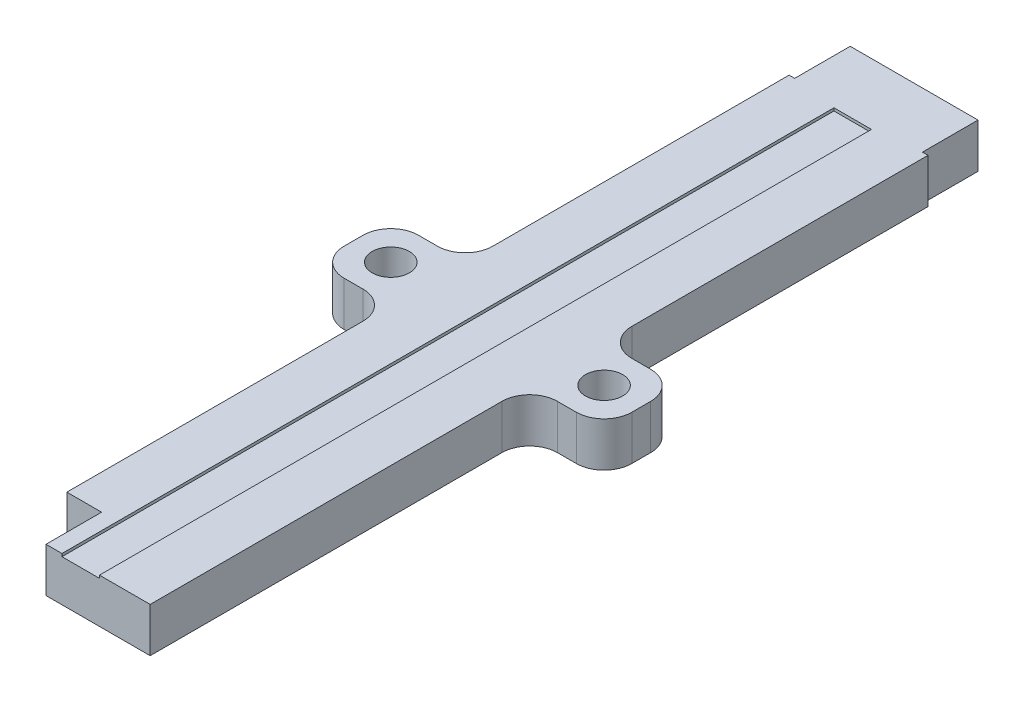
ISO-10303-21;
HEADER;
FILE_DESCRIPTION(('STEP AP214'),'2;1');
FILE_NAME('part.step','',(''),(''),'','','');
FILE_SCHEMA(('AUTOMOTIVE_DESIGN { 1 0 10303 214 1 1 1 1 }'));
ENDSEC;
DATA;
#1=APPLICATION_CONTEXT('core data for automotive mechanical design processes');
#2=APPLICATION_PROTOCOL_DEFINITION('international standard','automotive_design',2000,#1);
#3=PRODUCT_CONTEXT('',#1,'mechanical');
#4=PRODUCT('Part','Part','',(#3));
#5=PRODUCT_RELATED_PRODUCT_CATEGORY('part','',(#4));
#6=PRODUCT_DEFINITION_FORMATION('','',#4);
#7=PRODUCT_DEFINITION_CONTEXT('part definition',#1,'design');
#8=PRODUCT_DEFINITION('design','',#6,#7);
#9=PRODUCT_DEFINITION_SHAPE('','',#8);
#10=(LENGTH_UNIT() NAMED_UNIT(*) SI_UNIT(.MILLI.,.METRE.));
#11=(NAMED_UNIT(*) PLANE_ANGLE_UNIT() SI_UNIT($,.RADIAN.));
#12=(NAMED_UNIT(*) SI_UNIT($,.STERADIAN.) SOLID_ANGLE_UNIT());
#13=UNCERTAINTY_MEASURE_WITH_UNIT(LENGTH_MEASURE(1.E-05),#10,'distance_accuracy_value','');
#14=(GEOMETRIC_REPRESENTATION_CONTEXT(3) GLOBAL_UNCERTAINTY_ASSIGNED_CONTEXT((#13)) GLOBAL_UNIT_ASSIGNED_CONTEXT((#10,
#11,#12)) REPRESENTATION_CONTEXT('',''));
#15=CARTESIAN_POINT('',(0.,0.,0.));
#16=DIRECTION('',(0.,0.,1.));
#17=DIRECTION('',(1.,0.,0.));
#18=AXIS2_PLACEMENT_3D('',#15,#16,#17);
#19=CARTESIAN_POINT('',(-6.35,-2.032,228.6));
#20=DIRECTION('',(1.,0.,0.));
#21=DIRECTION('',(0.,0.,-1.));
#22=AXIS2_PLACEMENT_3D('',#19,#20,#21);
#23=PLANE('',#22);
#24=DIRECTION('',(0.,0.,-1.));
#25=VECTOR('',#24,1.);
#26=CARTESIAN_POINT('',(-6.35,2.032,228.6));
#27=LINE('',#26,#25);
#28=CARTESIAN_POINT('',(-6.34999999999998,2.032,71.12));
#29=VERTEX_POINT('',#28);
#30=CARTESIAN_POINT('',(-6.35,2.032,44.04106));
#31=VERTEX_POINT('',#30);
#32=EDGE_CURVE('E307',#29,#31,#27,.T.);
#33=ORIENTED_EDGE('',*,*,#32,.T.);
#34=DIRECTION('',(0.,1.,0.));
#35=VECTOR('',#34,1.);
#36=CARTESIAN_POINT('',(-6.35,-2.032,44.04106));
#37=LINE('',#36,#35);
#38=CARTESIAN_POINT('',(-6.35,-2.032,44.04106));
#39=VERTEX_POINT('',#38);
#40=EDGE_CURVE('E453',#31,#39,#37,.F.);
#41=ORIENTED_EDGE('',*,*,#40,.T.);
#42=DIRECTION('',(0.,0.,-1.));
#43=VECTOR('',#42,1.);
#44=CARTESIAN_POINT('',(-6.35,-2.032,228.6));
#45=LINE('',#44,#43);
#46=CARTESIAN_POINT('',(-6.34999999999998,-2.032,71.12));
#47=VERTEX_POINT('',#46);
#48=EDGE_CURVE('E263',#47,#39,#45,.T.);
#49=ORIENTED_EDGE('',*,*,#48,.F.);
#50=DIRECTION('',(0.,1.,0.));
#51=VECTOR('',#50,1.);
#52=CARTESIAN_POINT('',(-6.34999999999998,-2.032,71.12));
#53=LINE('',#52,#51);
#54=EDGE_CURVE('E338',#47,#29,#53,.T.);
#55=ORIENTED_EDGE('',*,*,#54,.T.);
#56=EDGE_LOOP('',(#33,#41,#49,#55));
#57=FACE_BOUND('',#56,.T.);
#58=ADVANCED_FACE('F33',(#57),#23,.F.);
#59=CARTESIAN_POINT('',(6.35,-2.032,228.6));
#60=DIRECTION('',(-1.,0.,0.));
#61=DIRECTION('',(0.,0.,1.));
#62=AXIS2_PLACEMENT_3D('',#59,#60,#61);
#63=PLANE('',#62);
#64=DIRECTION('',(0.,0.,-1.));
#65=VECTOR('',#64,1.);
#66=CARTESIAN_POINT('',(6.35,2.032,228.6));
#67=LINE('',#66,#65);
#68=CARTESIAN_POINT('',(6.35,2.032,32.15894));
#69=VERTEX_POINT('',#68);
#70=CARTESIAN_POINT('',(6.34999999999999,2.032,5.08));
#71=VERTEX_POINT('',#70);
#72=EDGE_CURVE('E305',#69,#71,#67,.T.);
#73=ORIENTED_EDGE('',*,*,#72,.F.);
#74=DIRECTION('',(0.,1.,0.));
#75=VECTOR('',#74,1.);
#76=CARTESIAN_POINT('',(6.35,-2.032,32.15894));
#77=LINE('',#76,#75);
#78=CARTESIAN_POINT('',(6.35,-2.032,32.15894));
#79=VERTEX_POINT('',#78);
#80=EDGE_CURVE('E427',#69,#79,#77,.F.);
#81=ORIENTED_EDGE('',*,*,#80,.T.);
#82=DIRECTION('',(0.,0.,-1.));
#83=VECTOR('',#82,1.);
#84=CARTESIAN_POINT('',(6.35,-2.032,228.6));
#85=LINE('',#84,#83);
#86=CARTESIAN_POINT('',(6.34999999999999,-2.032,5.08));
#87=VERTEX_POINT('',#86);
#88=EDGE_CURVE('E261',#79,#87,#85,.T.);
#89=ORIENTED_EDGE('',*,*,#88,.T.);
#90=DIRECTION('',(0.,1.,0.));
#91=VECTOR('',#90,1.);
#92=CARTESIAN_POINT('',(6.34999999999999,-2.032,5.08));
#93=LINE('',#92,#91);
#94=EDGE_CURVE('E361',#87,#71,#93,.T.);
#95=ORIENTED_EDGE('',*,*,#94,.T.);
#96=EDGE_LOOP('',(#73,#81,#89,#95));
#97=FACE_BOUND('',#96,.T.);
#98=ADVANCED_FACE('F425',(#97),#63,.F.);
#99=CARTESIAN_POINT('',(-6.35,2.032,228.6));
#100=DIRECTION('',(0.,-1.,0.));
#101=DIRECTION('',(0.,0.,-1.));
#102=AXIS2_PLACEMENT_3D('',#99,#100,#101);
#103=PLANE('',#102);
#104=DIRECTION('',(1.,0.,0.));
#105=VECTOR('',#104,1.);
#106=CARTESIAN_POINT('',(6.35,2.032,41.50106));
#107=LINE('',#106,#105);
#108=CARTESIAN_POINT('',(8.89,2.032,41.50106));
#109=VERTEX_POINT('',#108);
#110=CARTESIAN_POINT('',(10.61212,2.032,41.50106));
#111=VERTEX_POINT('',#110);
#112=EDGE_CURVE('E525',#109,#111,#107,.T.);
#113=ORIENTED_EDGE('',*,*,#112,.T.);
#114=CARTESIAN_POINT('',(10.61212,2.032,38.96106));
#115=DIRECTION('',(0.,-1.,0.));
#116=DIRECTION('',(0.,0.,-1.));
#117=AXIS2_PLACEMENT_3D('',#114,#115,#116);
#118=CIRCLE('',#117,2.54);
#119=CARTESIAN_POINT('',(13.15212,2.032,38.96106));
#120=VERTEX_POINT('',#119);
#121=EDGE_CURVE('E498',#111,#120,#118,.F.);
#122=ORIENTED_EDGE('',*,*,#121,.T.);
#123=DIRECTION('',(0.,0.,-1.));
#124=VECTOR('',#123,1.);
#125=CARTESIAN_POINT('',(13.15212,2.032,34.69894));
#126=LINE('',#125,#124);
#127=CARTESIAN_POINT('',(13.15212,2.032,37.23894));
#128=VERTEX_POINT('',#127);
#129=EDGE_CURVE('E302',#120,#128,#126,.T.);
#130=ORIENTED_EDGE('',*,*,#129,.T.);
#131=CARTESIAN_POINT('',(10.61212,2.032,37.23894));
#132=DIRECTION('',(0.,-1.,0.));
#133=DIRECTION('',(0.,0.,-1.));
#134=AXIS2_PLACEMENT_3D('',#131,#132,#133);
#135=CIRCLE('',#134,2.54);
#136=CARTESIAN_POINT('',(10.61212,2.032,34.69894));
#137=VERTEX_POINT('',#136);
#138=EDGE_CURVE('E523',#128,#137,#135,.F.);
#139=ORIENTED_EDGE('',*,*,#138,.T.);
#140=DIRECTION('',(-1.,0.,0.));
#141=VECTOR('',#140,1.);
#142=CARTESIAN_POINT('',(6.35,2.032,34.69894));
#143=LINE('',#142,#141);
#144=CARTESIAN_POINT('',(8.89,2.032,34.69894));
#145=VERTEX_POINT('',#144);
#146=EDGE_CURVE('E297',#137,#145,#143,.T.);
#147=ORIENTED_EDGE('',*,*,#146,.T.);
#148=CARTESIAN_POINT('',(8.89,2.032,32.15894));
#149=DIRECTION('',(0.,-1.,0.));
#150=DIRECTION('',(0.,0.,-1.));
#151=AXIS2_PLACEMENT_3D('',#148,#149,#150);
#152=CIRCLE('',#151,2.54);
#153=EDGE_CURVE('E434',#145,#69,#152,.T.);
#154=ORIENTED_EDGE('',*,*,#153,.T.);
#155=ORIENTED_EDGE('',*,*,#72,.T.);
#156=DIRECTION('',(1.,0.,0.));
#157=VECTOR('',#156,1.);
#158=CARTESIAN_POINT('',(6.34999999999999,2.032,5.08));
#159=LINE('',#158,#157);
#160=CARTESIAN_POINT('',(5.84199999999999,2.032,5.08));
#161=VERTEX_POINT('',#160);
#162=EDGE_CURVE('E353',#161,#71,#159,.T.);
#163=ORIENTED_EDGE('',*,*,#162,.F.);
#164=DIRECTION('',(0.,0.,1.));
#165=VECTOR('',#164,1.);
#166=CARTESIAN_POINT('',(5.84199999999999,2.032,0.));
#167=LINE('',#166,#165);
#168=CARTESIAN_POINT('',(5.84199999999999,2.032,0.));
#169=VERTEX_POINT('',#168);
#170=EDGE_CURVE('E348',#169,#161,#167,.T.);
#171=ORIENTED_EDGE('',*,*,#170,.F.);
#172=DIRECTION('',(-1.,0.,0.));
#173=VECTOR('',#172,1.);
#174=CARTESIAN_POINT('',(-6.35,2.032,0.));
#175=LINE('',#174,#173);
#176=CARTESIAN_POINT('',(-5.84199999999999,2.032,0.));
#177=VERTEX_POINT('',#176);
#178=EDGE_CURVE('E404',#169,#177,#175,.T.);
#179=ORIENTED_EDGE('',*,*,#178,.T.);
#180=DIRECTION('',(0.,0.,1.));
#181=VECTOR('',#180,1.);
#182=CARTESIAN_POINT('',(-5.84199999999999,2.032,0.));
#183=LINE('',#182,#181);
#184=CARTESIAN_POINT('',(-5.84199999999999,2.032,5.08));
#185=VERTEX_POINT('',#184);
#186=EDGE_CURVE('E372',#177,#185,#183,.T.);
#187=ORIENTED_EDGE('',*,*,#186,.T.);
#188=DIRECTION('',(-1.,0.,0.));
#189=VECTOR('',#188,1.);
#190=CARTESIAN_POINT('',(-6.34999999999999,2.032,5.08));
#191=LINE('',#190,#189);
#192=CARTESIAN_POINT('',(-6.34999999999999,2.032,5.08));
#193=VERTEX_POINT('',#192);
#194=EDGE_CURVE('E364',#185,#193,#191,.T.);
#195=ORIENTED_EDGE('',*,*,#194,.T.);
#196=CARTESIAN_POINT('',(-6.35,2.032,32.15894));
#197=VERTEX_POINT('',#196);
#198=EDGE_CURVE('E308',#197,#193,#27,.T.);
#199=ORIENTED_EDGE('',*,*,#198,.F.);
#200=CARTESIAN_POINT('',(-8.89,2.032,32.15894));
#201=DIRECTION('',(0.,-1.,0.));
#202=DIRECTION('',(0.,0.,-1.));
#203=AXIS2_PLACEMENT_3D('',#200,#201,#202);
#204=CIRCLE('',#203,2.54);
#205=CARTESIAN_POINT('',(-8.89,2.032,34.69894));
#206=VERTEX_POINT('',#205);
#207=EDGE_CURVE('E433',#197,#206,#204,.T.);
#208=ORIENTED_EDGE('',*,*,#207,.T.);
#209=DIRECTION('',(-1.,0.,0.));
#210=VECTOR('',#209,1.);
#211=CARTESIAN_POINT('',(-6.35,2.032,34.69894));
#212=LINE('',#211,#210);
#213=CARTESIAN_POINT('',(-10.61212,2.032,34.69894));
#214=VERTEX_POINT('',#213);
#215=EDGE_CURVE('E518',#206,#214,#212,.T.);
#216=ORIENTED_EDGE('',*,*,#215,.T.);
#217=CARTESIAN_POINT('',(-10.61212,2.032,37.23894));
#218=DIRECTION('',(0.,-1.,0.));
#219=DIRECTION('',(0.,0.,-1.));
#220=AXIS2_PLACEMENT_3D('',#217,#218,#219);
#221=CIRCLE('',#220,2.54);
#222=CARTESIAN_POINT('',(-13.15212,2.032,37.23894));
#223=VERTEX_POINT('',#222);
#224=EDGE_CURVE('E521',#214,#223,#221,.F.);
#225=ORIENTED_EDGE('',*,*,#224,.T.);
#226=DIRECTION('',(0.,0.,1.));
#227=VECTOR('',#226,1.);
#228=CARTESIAN_POINT('',(-13.15212,2.032,34.69894));
#229=LINE('',#228,#227);
#230=CARTESIAN_POINT('',(-13.15212,2.032,38.96106));
#231=VERTEX_POINT('',#230);
#232=EDGE_CURVE('E517',#223,#231,#229,.T.);
#233=ORIENTED_EDGE('',*,*,#232,.T.);
#234=CARTESIAN_POINT('',(-10.61212,2.032,38.96106));
#235=DIRECTION('',(0.,-1.,0.));
#236=DIRECTION('',(0.,0.,-1.));
#237=AXIS2_PLACEMENT_3D('',#234,#235,#236);
#238=CIRCLE('',#237,2.54);
#239=CARTESIAN_POINT('',(-10.61212,2.032,41.50106));
#240=VERTEX_POINT('',#239);
#241=EDGE_CURVE('E519',#231,#240,#238,.F.);
#242=ORIENTED_EDGE('',*,*,#241,.T.);
#243=DIRECTION('',(1.,0.,0.));
#244=VECTOR('',#243,1.);
#245=CARTESIAN_POINT('',(-6.35,2.032,41.50106));
#246=LINE('',#245,#244);
#247=CARTESIAN_POINT('',(-8.89,2.032,41.50106));
#248=VERTEX_POINT('',#247);
#249=EDGE_CURVE('E446',#240,#248,#246,.T.);
#250=ORIENTED_EDGE('',*,*,#249,.T.);
#251=CARTESIAN_POINT('',(-8.89,2.032,44.04106));
#252=DIRECTION('',(0.,-1.,0.));
#253=DIRECTION('',(0.,0.,-1.));
#254=AXIS2_PLACEMENT_3D('',#251,#252,#253);
#255=CIRCLE('',#254,2.54);
#256=EDGE_CURVE('E41',#248,#31,#255,.T.);
#257=ORIENTED_EDGE('',*,*,#256,.T.);
#258=ORIENTED_EDGE('',*,*,#32,.F.);
#259=DIRECTION('',(-1.,0.,0.));
#260=VECTOR('',#259,1.);
#261=CARTESIAN_POINT('',(-6.34999999999998,2.032,71.12));
#262=LINE('',#261,#260);
#263=CARTESIAN_POINT('',(-3.17499999999998,2.032,71.12));
#264=VERTEX_POINT('',#263);
#265=EDGE_CURVE('E241',#264,#29,#262,.T.);
#266=ORIENTED_EDGE('',*,*,#265,.F.);
#267=DIRECTION('',(0.,0.,-1.));
#268=VECTOR('',#267,1.);
#269=CARTESIAN_POINT('',(-3.17499999999998,2.032,71.12));
#270=LINE('',#269,#268);
#271=CARTESIAN_POINT('',(-3.17499999999998,2.032,76.2));
#272=VERTEX_POINT('',#271);
#273=EDGE_CURVE('E330',#272,#264,#270,.T.);
#274=ORIENTED_EDGE('',*,*,#273,.F.);
#275=DIRECTION('',(-1.,0.,0.));
#276=VECTOR('',#275,1.);
#277=CARTESIAN_POINT('',(-3.17499999999998,2.032,76.2));
#278=LINE('',#277,#276);
#279=CARTESIAN_POINT('',(-1.7145,2.032,76.2));
#280=VERTEX_POINT('',#279);
#281=EDGE_CURVE('E286',#280,#272,#278,.T.);
#282=ORIENTED_EDGE('',*,*,#281,.F.);
#283=DIRECTION('',(0.,0.,1.));
#284=VECTOR('',#283,1.);
#285=CARTESIAN_POINT('',(-1.7145,2.032,5.6134));
#286=LINE('',#285,#284);
#287=CARTESIAN_POINT('',(-1.7145,2.032,5.6134));
#288=VERTEX_POINT('',#287);
#289=EDGE_CURVE('E382',#288,#280,#286,.T.);
#290=ORIENTED_EDGE('',*,*,#289,.F.);
#291=DIRECTION('',(-1.,0.,0.));
#292=VECTOR('',#291,1.);
#293=CARTESIAN_POINT('',(-1.7145,2.032,5.6134));
#294=LINE('',#293,#292);
#295=CARTESIAN_POINT('',(1.7145,2.032,5.61339999999999));
#296=VERTEX_POINT('',#295);
#297=EDGE_CURVE('E391',#296,#288,#294,.T.);
#298=ORIENTED_EDGE('',*,*,#297,.F.);
#299=DIRECTION('',(0.,0.,-1.));
#300=VECTOR('',#299,1.);
#301=CARTESIAN_POINT('',(1.7145,2.032,5.61339999999999));
#302=LINE('',#301,#300);
#303=CARTESIAN_POINT('',(1.7145,2.032,76.2));
#304=VERTEX_POINT('',#303);
#305=EDGE_CURVE('E328',#304,#296,#302,.T.);
#306=ORIENTED_EDGE('',*,*,#305,.F.);
#307=CARTESIAN_POINT('',(6.35,2.032,76.2));
#308=VERTEX_POINT('',#307);
#309=EDGE_CURVE('E326',#308,#304,#278,.T.);
#310=ORIENTED_EDGE('',*,*,#309,.F.);
#311=CARTESIAN_POINT('',(6.35,2.032,44.04106));
#312=VERTEX_POINT('',#311);
#313=EDGE_CURVE('E251',#308,#312,#67,.T.);
#314=ORIENTED_EDGE('',*,*,#313,.T.);
#315=CARTESIAN_POINT('',(8.89,2.032,44.04106));
#316=DIRECTION('',(0.,-1.,0.));
#317=DIRECTION('',(0.,0.,-1.));
#318=AXIS2_PLACEMENT_3D('',#315,#316,#317);
#319=CIRCLE('',#318,2.54);
#320=EDGE_CURVE('E323',#312,#109,#319,.T.);
#321=ORIENTED_EDGE('',*,*,#320,.T.);
#322=EDGE_LOOP('',(#113,#122,#130,#139,#147,#154,#155,#163,#171,#179,#187,#195,#199,#208,#216,
#225,#233,#242,#250,#257,#258,#266,#274,#282,#290,#298,#306,#310,#314,#321));
#323=FACE_BOUND('',#322,.T.);
#324=CARTESIAN_POINT('',(9.75106,2.032,38.1));
#325=DIRECTION('',(0.,1.,0.));
#326=DIRECTION('',(0.,0.,1.));
#327=AXIS2_PLACEMENT_3D('',#324,#325,#326);
#328=CIRCLE('',#327,1.70053);
#329=CARTESIAN_POINT('',(9.75106,2.032,39.80053));
#330=VERTEX_POINT('',#329);
#331=EDGE_CURVE('E505',#330,#330,#328,.T.);
#332=ORIENTED_EDGE('',*,*,#331,.F.);
#333=EDGE_LOOP('',(#332));
#334=FACE_BOUND('',#333,.T.);
#335=CARTESIAN_POINT('',(-9.75106,2.032,38.1));
#336=DIRECTION('',(0.,1.,0.));
#337=DIRECTION('',(0.,0.,-1.));
#338=AXIS2_PLACEMENT_3D('',#335,#336,#337);
#339=CIRCLE('',#338,1.70053);
#340=CARTESIAN_POINT('',(-9.75106,2.032,36.39947));
#341=VERTEX_POINT('',#340);
#342=EDGE_CURVE('E575',#341,#341,#339,.T.);
#343=ORIENTED_EDGE('',*,*,#342,.F.);
#344=EDGE_LOOP('',(#343));
#345=FACE_BOUND('',#344,.T.);
#346=ADVANCED_FACE('F321',(#323,#334,#345),#103,.F.);
#347=CARTESIAN_POINT('',(-6.35,-2.032,228.6));
#348=DIRECTION('',(0.,1.,0.));
#349=DIRECTION('',(0.,0.,1.));
#350=AXIS2_PLACEMENT_3D('',#347,#348,#349);
#351=PLANE('',#350);
#352=DIRECTION('',(0.,0.,-1.));
#353=VECTOR('',#352,1.);
#354=CARTESIAN_POINT('',(13.15212,-2.032,34.69894));
#355=LINE('',#354,#353);
#356=CARTESIAN_POINT('',(13.15212,-2.032,38.96106));
#357=VERTEX_POINT('',#356);
#358=CARTESIAN_POINT('',(13.15212,-2.032,37.23894));
#359=VERTEX_POINT('',#358);
#360=EDGE_CURVE('E287',#357,#359,#355,.T.);
#361=ORIENTED_EDGE('',*,*,#360,.F.);
#362=CARTESIAN_POINT('',(10.61212,-2.032,38.96106));
#363=DIRECTION('',(0.,1.,0.));
#364=DIRECTION('',(0.,0.,1.));
#365=AXIS2_PLACEMENT_3D('',#362,#363,#364);
#366=CIRCLE('',#365,2.54);
#367=CARTESIAN_POINT('',(10.61212,-2.032,41.50106));
#368=VERTEX_POINT('',#367);
#369=EDGE_CURVE('E479',#357,#368,#366,.F.);
#370=ORIENTED_EDGE('',*,*,#369,.T.);
#371=DIRECTION('',(1.,0.,0.));
#372=VECTOR('',#371,1.);
#373=CARTESIAN_POINT('',(6.35,-2.032,41.50106));
#374=LINE('',#373,#372);
#375=CARTESIAN_POINT('',(8.89,-2.032,41.50106));
#376=VERTEX_POINT('',#375);
#377=EDGE_CURVE('E301',#376,#368,#374,.T.);
#378=ORIENTED_EDGE('',*,*,#377,.F.);
#379=CARTESIAN_POINT('',(8.89,-2.032,44.04106));
#380=DIRECTION('',(0.,1.,0.));
#381=DIRECTION('',(0.,0.,1.));
#382=AXIS2_PLACEMENT_3D('',#379,#380,#381);
#383=CIRCLE('',#382,2.54);
#384=CARTESIAN_POINT('',(6.35,-2.032,44.04106));
#385=VERTEX_POINT('',#384);
#386=EDGE_CURVE('E259',#376,#385,#383,.T.);
#387=ORIENTED_EDGE('',*,*,#386,.T.);
#388=CARTESIAN_POINT('',(6.35,-2.032,76.2));
#389=VERTEX_POINT('',#388);
#390=EDGE_CURVE('E248',#389,#385,#85,.T.);
#391=ORIENTED_EDGE('',*,*,#390,.F.);
#392=DIRECTION('',(-1.,0.,0.));
#393=VECTOR('',#392,1.);
#394=CARTESIAN_POINT('',(-3.17499999999998,-2.032,76.2));
#395=LINE('',#394,#393);
#396=CARTESIAN_POINT('',(-3.17499999999998,-2.032,76.2));
#397=VERTEX_POINT('',#396);
#398=EDGE_CURVE('E230',#389,#397,#395,.T.);
#399=ORIENTED_EDGE('',*,*,#398,.T.);
#400=DIRECTION('',(0.,0.,-1.));
#401=VECTOR('',#400,1.);
#402=CARTESIAN_POINT('',(-3.17499999999998,-2.032,71.12));
#403=LINE('',#402,#401);
#404=CARTESIAN_POINT('',(-3.17499999999998,-2.032,71.12));
#405=VERTEX_POINT('',#404);
#406=EDGE_CURVE('E240',#397,#405,#403,.T.);
#407=ORIENTED_EDGE('',*,*,#406,.T.);
#408=DIRECTION('',(-1.,0.,0.));
#409=VECTOR('',#408,1.);
#410=CARTESIAN_POINT('',(-6.34999999999998,-2.032,71.12));
#411=LINE('',#410,#409);
#412=EDGE_CURVE('E252',#405,#47,#411,.T.);
#413=ORIENTED_EDGE('',*,*,#412,.T.);
#414=ORIENTED_EDGE('',*,*,#48,.T.);
#415=CARTESIAN_POINT('',(-8.89,-2.032,44.04106));
#416=DIRECTION('',(0.,1.,0.));
#417=DIRECTION('',(0.,0.,1.));
#418=AXIS2_PLACEMENT_3D('',#415,#416,#417);
#419=CIRCLE('',#418,2.54);
#420=CARTESIAN_POINT('',(-8.89,-2.032,41.50106));
#421=VERTEX_POINT('',#420);
#422=EDGE_CURVE('E11',#39,#421,#419,.T.);
#423=ORIENTED_EDGE('',*,*,#422,.T.);
#424=DIRECTION('',(1.,0.,0.));
#425=VECTOR('',#424,1.);
#426=CARTESIAN_POINT('',(-6.35,-2.032,41.50106));
#427=LINE('',#426,#425);
#428=CARTESIAN_POINT('',(-10.61212,-2.032,41.50106));
#429=VERTEX_POINT('',#428);
#430=EDGE_CURVE('E502',#429,#421,#427,.T.);
#431=ORIENTED_EDGE('',*,*,#430,.F.);
#432=CARTESIAN_POINT('',(-10.61212,-2.032,38.96106));
#433=DIRECTION('',(0.,1.,0.));
#434=DIRECTION('',(0.,0.,1.));
#435=AXIS2_PLACEMENT_3D('',#432,#433,#434);
#436=CIRCLE('',#435,2.54);
#437=CARTESIAN_POINT('',(-13.15212,-2.032,38.96106));
#438=VERTEX_POINT('',#437);
#439=EDGE_CURVE('E288',#429,#438,#436,.F.);
#440=ORIENTED_EDGE('',*,*,#439,.T.);
#441=DIRECTION('',(0.,0.,1.));
#442=VECTOR('',#441,1.);
#443=CARTESIAN_POINT('',(-13.15212,-2.032,34.69894));
#444=LINE('',#443,#442);
#445=CARTESIAN_POINT('',(-13.15212,-2.032,37.23894));
#446=VERTEX_POINT('',#445);
#447=EDGE_CURVE('E506',#446,#438,#444,.T.);
#448=ORIENTED_EDGE('',*,*,#447,.F.);
#449=CARTESIAN_POINT('',(-10.61212,-2.032,37.23894));
#450=DIRECTION('',(0.,1.,0.));
#451=DIRECTION('',(0.,0.,1.));
#452=AXIS2_PLACEMENT_3D('',#449,#450,#451);
#453=CIRCLE('',#452,2.54);
#454=CARTESIAN_POINT('',(-10.61212,-2.032,34.69894));
#455=VERTEX_POINT('',#454);
#456=EDGE_CURVE('E482',#446,#455,#453,.F.);
#457=ORIENTED_EDGE('',*,*,#456,.T.);
#458=DIRECTION('',(-1.,0.,0.));
#459=VECTOR('',#458,1.);
#460=CARTESIAN_POINT('',(-6.35,-2.032,34.69894));
#461=LINE('',#460,#459);
#462=CARTESIAN_POINT('',(-8.89,-2.032,34.69894));
#463=VERTEX_POINT('',#462);
#464=EDGE_CURVE('E507',#463,#455,#461,.T.);
#465=ORIENTED_EDGE('',*,*,#464,.F.);
#466=CARTESIAN_POINT('',(-8.89,-2.032,32.15894));
#467=DIRECTION('',(0.,1.,0.));
#468=DIRECTION('',(0.,0.,1.));
#469=AXIS2_PLACEMENT_3D('',#466,#467,#468);
#470=CIRCLE('',#469,2.54);
#471=CARTESIAN_POINT('',(-6.35,-2.032,32.15894));
#472=VERTEX_POINT('',#471);
#473=EDGE_CURVE('E436',#463,#472,#470,.T.);
#474=ORIENTED_EDGE('',*,*,#473,.T.);
#475=CARTESIAN_POINT('',(-6.34999999999999,-2.032,5.08));
#476=VERTEX_POINT('',#475);
#477=EDGE_CURVE('E260',#472,#476,#45,.T.);
#478=ORIENTED_EDGE('',*,*,#477,.T.);
#479=DIRECTION('',(-1.,0.,0.));
#480=VECTOR('',#479,1.);
#481=CARTESIAN_POINT('',(-6.34999999999999,-2.032,5.08));
#482=LINE('',#481,#480);
#483=CARTESIAN_POINT('',(-5.84199999999999,-2.032,5.08));
#484=VERTEX_POINT('',#483);
#485=EDGE_CURVE('E368',#484,#476,#482,.T.);
#486=ORIENTED_EDGE('',*,*,#485,.F.);
#487=DIRECTION('',(0.,0.,1.));
#488=VECTOR('',#487,1.);
#489=CARTESIAN_POINT('',(-5.84199999999999,-2.032,0.));
#490=LINE('',#489,#488);
#491=CARTESIAN_POINT('',(-5.84199999999999,-2.032,0.));
#492=VERTEX_POINT('',#491);
#493=EDGE_CURVE('E371',#492,#484,#490,.T.);
#494=ORIENTED_EDGE('',*,*,#493,.F.);
#495=DIRECTION('',(1.,0.,0.));
#496=VECTOR('',#495,1.);
#497=CARTESIAN_POINT('',(-6.35,-2.032,0.));
#498=LINE('',#497,#496);
#499=CARTESIAN_POINT('',(5.84199999999999,-2.032,0.));
#500=VERTEX_POINT('',#499);
#501=EDGE_CURVE('E265',#492,#500,#498,.T.);
#502=ORIENTED_EDGE('',*,*,#501,.T.);
#503=DIRECTION('',(0.,0.,1.));
#504=VECTOR('',#503,1.);
#505=CARTESIAN_POINT('',(5.84199999999999,-2.032,0.));
#506=LINE('',#505,#504);
#507=CARTESIAN_POINT('',(5.84199999999999,-2.032,5.08));
#508=VERTEX_POINT('',#507);
#509=EDGE_CURVE('E349',#500,#508,#506,.T.);
#510=ORIENTED_EDGE('',*,*,#509,.T.);
#511=DIRECTION('',(1.,0.,0.));
#512=VECTOR('',#511,1.);
#513=CARTESIAN_POINT('',(6.34999999999999,-2.032,5.08));
#514=LINE('',#513,#512);
#515=EDGE_CURVE('E352',#508,#87,#514,.T.);
#516=ORIENTED_EDGE('',*,*,#515,.T.);
#517=ORIENTED_EDGE('',*,*,#88,.F.);
#518=CARTESIAN_POINT('',(8.89,-2.032,32.15894));
#519=DIRECTION('',(0.,1.,0.));
#520=DIRECTION('',(0.,0.,1.));
#521=AXIS2_PLACEMENT_3D('',#518,#519,#520);
#522=CIRCLE('',#521,2.54);
#523=CARTESIAN_POINT('',(8.89,-2.032,34.69894));
#524=VERTEX_POINT('',#523);
#525=EDGE_CURVE('E48',#79,#524,#522,.T.);
#526=ORIENTED_EDGE('',*,*,#525,.T.);
#527=DIRECTION('',(-1.,0.,0.));
#528=VECTOR('',#527,1.);
#529=CARTESIAN_POINT('',(6.35,-2.032,34.69894));
#530=LINE('',#529,#528);
#531=CARTESIAN_POINT('',(10.61212,-2.032,34.69894));
#532=VERTEX_POINT('',#531);
#533=EDGE_CURVE('E283',#532,#524,#530,.T.);
#534=ORIENTED_EDGE('',*,*,#533,.F.);
#535=CARTESIAN_POINT('',(10.61212,-2.032,37.23894));
#536=DIRECTION('',(0.,1.,0.));
#537=DIRECTION('',(0.,0.,1.));
#538=AXIS2_PLACEMENT_3D('',#535,#536,#537);
#539=CIRCLE('',#538,2.54);
#540=EDGE_CURVE('E481',#532,#359,#539,.F.);
#541=ORIENTED_EDGE('',*,*,#540,.T.);
#542=EDGE_LOOP('',(#361,#370,#378,#387,#391,#399,#407,#413,#414,#423,#431,#440,#448,#457,#465,
#474,#478,#486,#494,#502,#510,#516,#517,#526,#534,#541));
#543=FACE_BOUND('',#542,.T.);
#544=CARTESIAN_POINT('',(9.75106,-2.032,38.1));
#545=DIRECTION('',(0.,1.,0.));
#546=DIRECTION('',(0.,0.,1.));
#547=AXIS2_PLACEMENT_3D('',#544,#545,#546);
#548=CIRCLE('',#547,1.70053);
#549=CARTESIAN_POINT('',(9.75106,-2.032,39.80053));
#550=VERTEX_POINT('',#549);
#551=EDGE_CURVE('E540',#550,#550,#548,.T.);
#552=ORIENTED_EDGE('',*,*,#551,.T.);
#553=EDGE_LOOP('',(#552));
#554=FACE_BOUND('',#553,.T.);
#555=CARTESIAN_POINT('',(-9.75106,-2.032,38.1));
#556=DIRECTION('',(0.,1.,0.));
#557=DIRECTION('',(0.,0.,-1.));
#558=AXIS2_PLACEMENT_3D('',#555,#556,#557);
#559=CIRCLE('',#558,1.70053);
#560=CARTESIAN_POINT('',(-9.75106,-2.032,36.39947));
#561=VERTEX_POINT('',#560);
#562=EDGE_CURVE('E572',#561,#561,#559,.T.);
#563=ORIENTED_EDGE('',*,*,#562,.T.);
#564=EDGE_LOOP('',(#563));
#565=FACE_BOUND('',#564,.T.);
#566=ADVANCED_FACE('F255',(#543,#554,#565),#351,.F.);
#567=ORIENTED_EDGE('',*,*,#390,.T.);
#568=DIRECTION('',(0.,1.,0.));
#569=VECTOR('',#568,1.);
#570=CARTESIAN_POINT('',(6.35,-2.032,44.04106));
#571=LINE('',#570,#569);
#572=EDGE_CURVE('E314',#385,#312,#571,.T.);
#573=ORIENTED_EDGE('',*,*,#572,.T.);
#574=ORIENTED_EDGE('',*,*,#313,.F.);
#575=DIRECTION('',(0.,1.,0.));
#576=VECTOR('',#575,1.);
#577=CARTESIAN_POINT('',(6.35,-2.032,76.2));
#578=LINE('',#577,#576);
#579=EDGE_CURVE('E233',#389,#308,#578,.T.);
#580=ORIENTED_EDGE('',*,*,#579,.F.);
#581=EDGE_LOOP('',(#567,#573,#574,#580));
#582=FACE_BOUND('',#581,.T.);
#583=ADVANCED_FACE('F246',(#582),#63,.F.);
#584=ORIENTED_EDGE('',*,*,#477,.F.);
#585=DIRECTION('',(0.,1.,0.));
#586=VECTOR('',#585,1.);
#587=CARTESIAN_POINT('',(-6.35,-2.032,32.15894));
#588=LINE('',#587,#586);
#589=EDGE_CURVE('E473',#472,#197,#588,.T.);
#590=ORIENTED_EDGE('',*,*,#589,.T.);
#591=ORIENTED_EDGE('',*,*,#198,.T.);
#592=DIRECTION('',(0.,1.,0.));
#593=VECTOR('',#592,1.);
#594=CARTESIAN_POINT('',(-6.34999999999999,-2.032,5.08));
#595=LINE('',#594,#593);
#596=EDGE_CURVE('E374',#476,#193,#595,.T.);
#597=ORIENTED_EDGE('',*,*,#596,.F.);
#598=EDGE_LOOP('',(#584,#590,#591,#597));
#599=FACE_BOUND('',#598,.T.);
#600=ADVANCED_FACE('F555',(#599),#23,.F.);
#601=CARTESIAN_POINT('',(0.,0.,0.));
#602=DIRECTION('',(0.,0.,-1.));
#603=DIRECTION('',(-1.,0.,0.));
#604=AXIS2_PLACEMENT_3D('',#601,#602,#603);
#605=PLANE('',#604);
#606=DIRECTION('',(0.,1.,0.));
#607=VECTOR('',#606,1.);
#608=CARTESIAN_POINT('',(5.84199999999999,-2.032,0.));
#609=LINE('',#608,#607);
#610=EDGE_CURVE('E356',#500,#169,#609,.T.);
#611=ORIENTED_EDGE('',*,*,#610,.F.);
#612=ORIENTED_EDGE('',*,*,#501,.F.);
#613=DIRECTION('',(0.,1.,0.));
#614=VECTOR('',#613,1.);
#615=CARTESIAN_POINT('',(-5.84199999999999,-2.032,0.));
#616=LINE('',#615,#614);
#617=EDGE_CURVE('E379',#492,#177,#616,.T.);
#618=ORIENTED_EDGE('',*,*,#617,.T.);
#619=ORIENTED_EDGE('',*,*,#178,.F.);
#620=EDGE_LOOP('',(#611,#612,#618,#619));
#621=FACE_BOUND('',#620,.T.);
#622=ADVANCED_FACE('F415',(#621),#605,.T.);
#623=CARTESIAN_POINT('',(-1.7145,1.778,5.6134));
#624=DIRECTION('',(-1.,0.,0.));
#625=DIRECTION('',(0.,0.,1.));
#626=AXIS2_PLACEMENT_3D('',#623,#624,#625);
#627=PLANE('',#626);
#628=ORIENTED_EDGE('',*,*,#289,.T.);
#629=DIRECTION('',(0.,-1.,0.));
#630=VECTOR('',#629,1.);
#631=CARTESIAN_POINT('',(-1.7145,1.778,76.2));
#632=LINE('',#631,#630);
#633=CARTESIAN_POINT('',(-1.7145,1.778,76.2));
#634=VERTEX_POINT('',#633);
#635=EDGE_CURVE('E346',#280,#634,#632,.T.);
#636=ORIENTED_EDGE('',*,*,#635,.T.);
#637=DIRECTION('',(0.,0.,1.));
#638=VECTOR('',#637,1.);
#639=CARTESIAN_POINT('',(-1.7145,1.778,5.6134));
#640=LINE('',#639,#638);
#641=CARTESIAN_POINT('',(-1.7145,1.778,5.6134));
#642=VERTEX_POINT('',#641);
#643=EDGE_CURVE('E387',#642,#634,#640,.T.);
#644=ORIENTED_EDGE('',*,*,#643,.F.);
#645=DIRECTION('',(0.,1.,0.));
#646=VECTOR('',#645,1.);
#647=CARTESIAN_POINT('',(-1.7145,1.778,5.6134));
#648=LINE('',#647,#646);
#649=EDGE_CURVE('E402',#642,#288,#648,.T.);
#650=ORIENTED_EDGE('',*,*,#649,.T.);
#651=EDGE_LOOP('',(#628,#636,#644,#650));
#652=FACE_BOUND('',#651,.T.);
#653=ADVANCED_FACE('F619',(#652),#627,.F.);
#654=CARTESIAN_POINT('',(-1.7145,1.778,5.6134));
#655=DIRECTION('',(0.,0.,-1.));
#656=DIRECTION('',(-1.,0.,0.));
#657=AXIS2_PLACEMENT_3D('',#654,#655,#656);
#658=PLANE('',#657);
#659=ORIENTED_EDGE('',*,*,#297,.T.);
#660=ORIENTED_EDGE('',*,*,#649,.F.);
#661=DIRECTION('',(-1.,0.,0.));
#662=VECTOR('',#661,1.);
#663=CARTESIAN_POINT('',(-1.7145,1.778,5.6134));
#664=LINE('',#663,#662);
#665=CARTESIAN_POINT('',(1.7145,1.778,5.61339999999999));
#666=VERTEX_POINT('',#665);
#667=EDGE_CURVE('E393',#666,#642,#664,.T.);
#668=ORIENTED_EDGE('',*,*,#667,.F.);
#669=DIRECTION('',(0.,1.,0.));
#670=VECTOR('',#669,1.);
#671=CARTESIAN_POINT('',(1.7145,1.778,5.61339999999999));
#672=LINE('',#671,#670);
#673=EDGE_CURVE('E396',#666,#296,#672,.T.);
#674=ORIENTED_EDGE('',*,*,#673,.T.);
#675=EDGE_LOOP('',(#659,#660,#668,#674));
#676=FACE_BOUND('',#675,.T.);
#677=ADVANCED_FACE('F820',(#676),#658,.F.);
#678=CARTESIAN_POINT('',(1.7145,1.778,5.61339999999999));
#679=DIRECTION('',(1.,0.,0.));
#680=DIRECTION('',(0.,0.,-1.));
#681=AXIS2_PLACEMENT_3D('',#678,#679,#680);
#682=PLANE('',#681);
#683=DIRECTION('',(0.,0.,-1.));
#684=VECTOR('',#683,1.);
#685=CARTESIAN_POINT('',(1.7145,1.778,5.61339999999999));
#686=LINE('',#685,#684);
#687=CARTESIAN_POINT('',(1.7145,1.778,76.2));
#688=VERTEX_POINT('',#687);
#689=EDGE_CURVE('E390',#688,#666,#686,.T.);
#690=ORIENTED_EDGE('',*,*,#689,.F.);
#691=DIRECTION('',(0.,1.,0.));
#692=VECTOR('',#691,1.);
#693=CARTESIAN_POINT('',(1.7145,1.778,76.2));
#694=LINE('',#693,#692);
#695=EDGE_CURVE('E341',#688,#304,#694,.T.);
#696=ORIENTED_EDGE('',*,*,#695,.T.);
#697=ORIENTED_EDGE('',*,*,#305,.T.);
#698=ORIENTED_EDGE('',*,*,#673,.F.);
#699=EDGE_LOOP('',(#690,#696,#697,#698));
#700=FACE_BOUND('',#699,.T.);
#701=ADVANCED_FACE('F809',(#700),#682,.F.);
#702=CARTESIAN_POINT('',(0.,1.778,0.));
#703=DIRECTION('',(0.,1.,0.));
#704=DIRECTION('',(0.,0.,1.));
#705=AXIS2_PLACEMENT_3D('',#702,#703,#704);
#706=PLANE('',#705);
#707=DIRECTION('',(-1.,0.,0.));
#708=VECTOR('',#707,1.);
#709=CARTESIAN_POINT('',(0.,1.778,76.2));
#710=LINE('',#709,#708);
#711=EDGE_CURVE('E312',#688,#634,#710,.T.);
#712=ORIENTED_EDGE('',*,*,#711,.F.);
#713=ORIENTED_EDGE('',*,*,#689,.T.);
#714=ORIENTED_EDGE('',*,*,#667,.T.);
#715=ORIENTED_EDGE('',*,*,#643,.T.);
#716=EDGE_LOOP('',(#712,#713,#714,#715));
#717=FACE_BOUND('',#716,.T.);
#718=ADVANCED_FACE('F801',(#717),#706,.T.);
#719=CARTESIAN_POINT('',(-5.84199999999999,-2.032,0.));
#720=DIRECTION('',(-1.,0.,0.));
#721=DIRECTION('',(0.,0.,1.));
#722=AXIS2_PLACEMENT_3D('',#719,#720,#721);
#723=PLANE('',#722);
#724=ORIENTED_EDGE('',*,*,#186,.F.);
#725=ORIENTED_EDGE('',*,*,#617,.F.);
#726=ORIENTED_EDGE('',*,*,#493,.T.);
#727=DIRECTION('',(0.,1.,0.));
#728=VECTOR('',#727,1.);
#729=CARTESIAN_POINT('',(-5.84199999999999,-2.032,5.08));
#730=LINE('',#729,#728);
#731=EDGE_CURVE('E383',#484,#185,#730,.T.);
#732=ORIENTED_EDGE('',*,*,#731,.T.);
#733=EDGE_LOOP('',(#724,#725,#726,#732));
#734=FACE_BOUND('',#733,.T.);
#735=ADVANCED_FACE('F562',(#734),#723,.T.);
#736=CARTESIAN_POINT('',(-6.34999999999999,-2.032,5.08));
#737=DIRECTION('',(0.,0.,-1.));
#738=DIRECTION('',(-1.,0.,0.));
#739=AXIS2_PLACEMENT_3D('',#736,#737,#738);
#740=PLANE('',#739);
#741=ORIENTED_EDGE('',*,*,#194,.F.);
#742=ORIENTED_EDGE('',*,*,#731,.F.);
#743=ORIENTED_EDGE('',*,*,#485,.T.);
#744=ORIENTED_EDGE('',*,*,#596,.T.);
#745=EDGE_LOOP('',(#741,#742,#743,#744));
#746=FACE_BOUND('',#745,.T.);
#747=ADVANCED_FACE('F559',(#746),#740,.T.);
#748=CARTESIAN_POINT('',(6.34999999999999,-2.032,5.08));
#749=DIRECTION('',(0.,0.,1.));
#750=DIRECTION('',(1.,0.,0.));
#751=AXIS2_PLACEMENT_3D('',#748,#749,#750);
#752=PLANE('',#751);
#753=ORIENTED_EDGE('',*,*,#162,.T.);
#754=ORIENTED_EDGE('',*,*,#94,.F.);
#755=ORIENTED_EDGE('',*,*,#515,.F.);
#756=DIRECTION('',(0.,1.,0.));
#757=VECTOR('',#756,1.);
#758=CARTESIAN_POINT('',(5.84199999999999,-2.032,5.08));
#759=LINE('',#758,#757);
#760=EDGE_CURVE('E365',#508,#161,#759,.T.);
#761=ORIENTED_EDGE('',*,*,#760,.T.);
#762=EDGE_LOOP('',(#753,#754,#755,#761));
#763=FACE_BOUND('',#762,.T.);
#764=ADVANCED_FACE('F422',(#763),#752,.F.);
#765=CARTESIAN_POINT('',(5.84199999999999,-2.032,0.));
#766=DIRECTION('',(-1.,0.,0.));
#767=DIRECTION('',(0.,0.,1.));
#768=AXIS2_PLACEMENT_3D('',#765,#766,#767);
#769=PLANE('',#768);
#770=ORIENTED_EDGE('',*,*,#170,.T.);
#771=ORIENTED_EDGE('',*,*,#760,.F.);
#772=ORIENTED_EDGE('',*,*,#509,.F.);
#773=ORIENTED_EDGE('',*,*,#610,.T.);
#774=EDGE_LOOP('',(#770,#771,#772,#773));
#775=FACE_BOUND('',#774,.T.);
#776=ADVANCED_FACE('F417',(#775),#769,.F.);
#777=CARTESIAN_POINT('',(-3.17499999999998,-2.032,76.2));
#778=DIRECTION('',(0.,0.,-1.));
#779=DIRECTION('',(-1.,0.,0.));
#780=AXIS2_PLACEMENT_3D('',#777,#778,#779);
#781=PLANE('',#780);
#782=ORIENTED_EDGE('',*,*,#281,.T.);
#783=DIRECTION('',(0.,1.,0.));
#784=VECTOR('',#783,1.);
#785=CARTESIAN_POINT('',(-3.17499999999998,-2.032,76.2));
#786=LINE('',#785,#784);
#787=EDGE_CURVE('E236',#397,#272,#786,.T.);
#788=ORIENTED_EDGE('',*,*,#787,.F.);
#789=ORIENTED_EDGE('',*,*,#398,.F.);
#790=ORIENTED_EDGE('',*,*,#579,.T.);
#791=ORIENTED_EDGE('',*,*,#309,.T.);
#792=ORIENTED_EDGE('',*,*,#695,.F.);
#793=ORIENTED_EDGE('',*,*,#711,.T.);
#794=ORIENTED_EDGE('',*,*,#635,.F.);
#795=EDGE_LOOP('',(#782,#788,#789,#790,#791,#792,#793,#794));
#796=FACE_BOUND('',#795,.T.);
#797=ADVANCED_FACE('F232',(#796),#781,.F.);
#798=CARTESIAN_POINT('',(-6.34999999999998,-2.032,71.12));
#799=DIRECTION('',(0.,0.,-1.));
#800=DIRECTION('',(-1.,0.,0.));
#801=AXIS2_PLACEMENT_3D('',#798,#799,#800);
#802=PLANE('',#801);
#803=ORIENTED_EDGE('',*,*,#265,.T.);
#804=ORIENTED_EDGE('',*,*,#54,.F.);
#805=ORIENTED_EDGE('',*,*,#412,.F.);
#806=DIRECTION('',(0.,1.,0.));
#807=VECTOR('',#806,1.);
#808=CARTESIAN_POINT('',(-3.17499999999998,-2.032,71.12));
#809=LINE('',#808,#807);
#810=EDGE_CURVE('E342',#405,#264,#809,.T.);
#811=ORIENTED_EDGE('',*,*,#810,.T.);
#812=EDGE_LOOP('',(#803,#804,#805,#811));
#813=FACE_BOUND('',#812,.T.);
#814=ADVANCED_FACE('F760',(#813),#802,.F.);
#815=CARTESIAN_POINT('',(-3.17499999999998,-2.032,71.12));
#816=DIRECTION('',(1.,0.,0.));
#817=DIRECTION('',(0.,0.,-1.));
#818=AXIS2_PLACEMENT_3D('',#815,#816,#817);
#819=PLANE('',#818);
#820=ORIENTED_EDGE('',*,*,#273,.T.);
#821=ORIENTED_EDGE('',*,*,#810,.F.);
#822=ORIENTED_EDGE('',*,*,#406,.F.);
#823=ORIENTED_EDGE('',*,*,#787,.T.);
#824=EDGE_LOOP('',(#820,#821,#822,#823));
#825=FACE_BOUND('',#824,.T.);
#826=ADVANCED_FACE('F731',(#825),#819,.F.);
#827=CARTESIAN_POINT('',(6.35,-2.032,34.69894));
#828=DIRECTION('',(0.,0.,-1.));
#829=DIRECTION('',(-1.,0.,0.));
#830=AXIS2_PLACEMENT_3D('',#827,#828,#829);
#831=PLANE('',#830);
#832=ORIENTED_EDGE('',*,*,#146,.F.);
#833=DIRECTION('',(0.,1.,0.));
#834=VECTOR('',#833,1.);
#835=CARTESIAN_POINT('',(10.61212,-2.032,34.69894));
#836=LINE('',#835,#834);
#837=EDGE_CURVE('E55',#137,#532,#836,.F.);
#838=ORIENTED_EDGE('',*,*,#837,.T.);
#839=ORIENTED_EDGE('',*,*,#533,.T.);
#840=DIRECTION('',(0.,1.,0.));
#841=VECTOR('',#840,1.);
#842=CARTESIAN_POINT('',(8.89,-2.032,34.69894));
#843=LINE('',#842,#841);
#844=EDGE_CURVE('E432',#524,#145,#843,.T.);
#845=ORIENTED_EDGE('',*,*,#844,.T.);
#846=EDGE_LOOP('',(#832,#838,#839,#845));
#847=FACE_BOUND('',#846,.T.);
#848=ADVANCED_FACE('F723',(#847),#831,.T.);
#849=CARTESIAN_POINT('',(13.15212,-2.032,34.69894));
#850=DIRECTION('',(1.,0.,0.));
#851=DIRECTION('',(0.,0.,-1.));
#852=AXIS2_PLACEMENT_3D('',#849,#850,#851);
#853=PLANE('',#852);
#854=ORIENTED_EDGE('',*,*,#129,.F.);
#855=DIRECTION('',(0.,1.,0.));
#856=VECTOR('',#855,1.);
#857=CARTESIAN_POINT('',(13.15212,-2.032,38.96106));
#858=LINE('',#857,#856);
#859=EDGE_CURVE('E487',#120,#357,#858,.F.);
#860=ORIENTED_EDGE('',*,*,#859,.T.);
#861=ORIENTED_EDGE('',*,*,#360,.T.);
#862=DIRECTION('',(0.,1.,0.));
#863=VECTOR('',#862,1.);
#864=CARTESIAN_POINT('',(13.15212,-2.032,37.23894));
#865=LINE('',#864,#863);
#866=EDGE_CURVE('E491',#359,#128,#865,.T.);
#867=ORIENTED_EDGE('',*,*,#866,.T.);
#868=EDGE_LOOP('',(#854,#860,#861,#867));
#869=FACE_BOUND('',#868,.T.);
#870=ADVANCED_FACE('F529',(#869),#853,.T.);
#871=CARTESIAN_POINT('',(6.35,-2.032,41.50106));
#872=DIRECTION('',(0.,0.,1.));
#873=DIRECTION('',(1.,0.,0.));
#874=AXIS2_PLACEMENT_3D('',#871,#872,#873);
#875=PLANE('',#874);
#876=ORIENTED_EDGE('',*,*,#112,.F.);
#877=DIRECTION('',(0.,1.,0.));
#878=VECTOR('',#877,1.);
#879=CARTESIAN_POINT('',(8.89,-2.032,41.50106));
#880=LINE('',#879,#878);
#881=EDGE_CURVE('E303',#109,#376,#880,.F.);
#882=ORIENTED_EDGE('',*,*,#881,.T.);
#883=ORIENTED_EDGE('',*,*,#377,.T.);
#884=DIRECTION('',(0.,1.,0.));
#885=VECTOR('',#884,1.);
#886=CARTESIAN_POINT('',(10.61212,-2.032,41.50106));
#887=LINE('',#886,#885);
#888=EDGE_CURVE('E317',#368,#111,#887,.T.);
#889=ORIENTED_EDGE('',*,*,#888,.T.);
#890=EDGE_LOOP('',(#876,#882,#883,#889));
#891=FACE_BOUND('',#890,.T.);
#892=ADVANCED_FACE('F536',(#891),#875,.T.);
#893=CARTESIAN_POINT('',(9.75106,-2.032,38.1));
#894=DIRECTION('',(0.,1.,0.));
#895=DIRECTION('',(0.,0.,1.));
#896=AXIS2_PLACEMENT_3D('',#893,#894,#895);
#897=CYLINDRICAL_SURFACE('',#896,1.70053);
#898=ORIENTED_EDGE('',*,*,#551,.F.);
#899=EDGE_LOOP('',(#898));
#900=FACE_BOUND('',#899,.T.);
#901=ORIENTED_EDGE('',*,*,#331,.T.);
#902=EDGE_LOOP('',(#901));
#903=FACE_BOUND('',#902,.T.);
#904=ADVANCED_FACE('F601',(#900,#903),#897,.F.);
#905=CARTESIAN_POINT('',(-6.35,-2.032,34.69894));
#906=DIRECTION('',(0.,0.,-1.));
#907=DIRECTION('',(-1.,0.,0.));
#908=AXIS2_PLACEMENT_3D('',#905,#906,#907);
#909=PLANE('',#908);
#910=ORIENTED_EDGE('',*,*,#215,.F.);
#911=DIRECTION('',(0.,1.,0.));
#912=VECTOR('',#911,1.);
#913=CARTESIAN_POINT('',(-8.89,-2.032,34.69894));
#914=LINE('',#913,#912);
#915=EDGE_CURVE('E468',#206,#463,#914,.F.);
#916=ORIENTED_EDGE('',*,*,#915,.T.);
#917=ORIENTED_EDGE('',*,*,#464,.T.);
#918=DIRECTION('',(0.,1.,0.));
#919=VECTOR('',#918,1.);
#920=CARTESIAN_POINT('',(-10.61212,-2.032,34.69894));
#921=LINE('',#920,#919);
#922=EDGE_CURVE('E470',#455,#214,#921,.T.);
#923=ORIENTED_EDGE('',*,*,#922,.T.);
#924=EDGE_LOOP('',(#910,#916,#917,#923));
#925=FACE_BOUND('',#924,.T.);
#926=ADVANCED_FACE('F570',(#925),#909,.T.);
#927=CARTESIAN_POINT('',(-6.35,-2.032,41.50106));
#928=DIRECTION('',(0.,0.,1.));
#929=DIRECTION('',(1.,0.,0.));
#930=AXIS2_PLACEMENT_3D('',#927,#928,#929);
#931=PLANE('',#930);
#932=ORIENTED_EDGE('',*,*,#249,.F.);
#933=DIRECTION('',(0.,1.,0.));
#934=VECTOR('',#933,1.);
#935=CARTESIAN_POINT('',(-10.61212,-2.032,41.50106));
#936=LINE('',#935,#934);
#937=EDGE_CURVE('E456',#240,#429,#936,.F.);
#938=ORIENTED_EDGE('',*,*,#937,.T.);
#939=ORIENTED_EDGE('',*,*,#430,.T.);
#940=DIRECTION('',(0.,1.,0.));
#941=VECTOR('',#940,1.);
#942=CARTESIAN_POINT('',(-8.89,-2.032,41.50106));
#943=LINE('',#942,#941);
#944=EDGE_CURVE('E459',#421,#248,#943,.T.);
#945=ORIENTED_EDGE('',*,*,#944,.T.);
#946=EDGE_LOOP('',(#932,#938,#939,#945));
#947=FACE_BOUND('',#946,.T.);
#948=ADVANCED_FACE('F592',(#947),#931,.T.);
#949=CARTESIAN_POINT('',(-13.15212,-2.032,34.69894));
#950=DIRECTION('',(-1.,0.,0.));
#951=DIRECTION('',(0.,0.,1.));
#952=AXIS2_PLACEMENT_3D('',#949,#950,#951);
#953=PLANE('',#952);
#954=ORIENTED_EDGE('',*,*,#232,.F.);
#955=DIRECTION('',(0.,1.,0.));
#956=VECTOR('',#955,1.);
#957=CARTESIAN_POINT('',(-13.15212,-2.032,37.23894));
#958=LINE('',#957,#956);
#959=EDGE_CURVE('E463',#223,#446,#958,.F.);
#960=ORIENTED_EDGE('',*,*,#959,.T.);
#961=ORIENTED_EDGE('',*,*,#447,.T.);
#962=DIRECTION('',(0.,1.,0.));
#963=VECTOR('',#962,1.);
#964=CARTESIAN_POINT('',(-13.15212,-2.032,38.96106));
#965=LINE('',#964,#963);
#966=EDGE_CURVE('E465',#438,#231,#965,.T.);
#967=ORIENTED_EDGE('',*,*,#966,.T.);
#968=EDGE_LOOP('',(#954,#960,#961,#967));
#969=FACE_BOUND('',#968,.T.);
#970=ADVANCED_FACE('F587',(#969),#953,.T.);
#971=CARTESIAN_POINT('',(-9.75106,-2.032,38.1));
#972=DIRECTION('',(0.,1.,0.));
#973=DIRECTION('',(0.,0.,1.));
#974=AXIS2_PLACEMENT_3D('',#971,#972,#973);
#975=CYLINDRICAL_SURFACE('',#974,1.70053);
#976=ORIENTED_EDGE('',*,*,#562,.F.);
#977=EDGE_LOOP('',(#976));
#978=FACE_BOUND('',#977,.T.);
#979=ORIENTED_EDGE('',*,*,#342,.T.);
#980=EDGE_LOOP('',(#979));
#981=FACE_BOUND('',#980,.T.);
#982=ADVANCED_FACE('F599',(#978,#981),#975,.F.);
#983=CARTESIAN_POINT('',(8.89,-2.032,44.04106));
#984=DIRECTION('',(0.,1.,0.));
#985=DIRECTION('',(0.,0.,1.));
#986=AXIS2_PLACEMENT_3D('',#983,#984,#985);
#987=CYLINDRICAL_SURFACE('',#986,2.54);
#988=ORIENTED_EDGE('',*,*,#386,.F.);
#989=ORIENTED_EDGE('',*,*,#881,.F.);
#990=ORIENTED_EDGE('',*,*,#320,.F.);
#991=ORIENTED_EDGE('',*,*,#572,.F.);
#992=EDGE_LOOP('',(#988,#989,#990,#991));
#993=FACE_BOUND('',#992,.T.);
#994=ADVANCED_FACE('F626',(#993),#987,.F.);
#995=CARTESIAN_POINT('',(10.61212,-2.032,38.96106));
#996=DIRECTION('',(0.,1.,0.));
#997=DIRECTION('',(0.,0.,1.));
#998=AXIS2_PLACEMENT_3D('',#995,#996,#997);
#999=CYLINDRICAL_SURFACE('',#998,2.54);
#1000=ORIENTED_EDGE('',*,*,#369,.F.);
#1001=ORIENTED_EDGE('',*,*,#859,.F.);
#1002=ORIENTED_EDGE('',*,*,#121,.F.);
#1003=ORIENTED_EDGE('',*,*,#888,.F.);
#1004=EDGE_LOOP('',(#1000,#1001,#1002,#1003));
#1005=FACE_BOUND('',#1004,.T.);
#1006=ADVANCED_FACE('F533',(#1005),#999,.T.);
#1007=CARTESIAN_POINT('',(10.61212,-2.032,37.23894));
#1008=DIRECTION('',(0.,1.,0.));
#1009=DIRECTION('',(0.,0.,1.));
#1010=AXIS2_PLACEMENT_3D('',#1007,#1008,#1009);
#1011=CYLINDRICAL_SURFACE('',#1010,2.54);
#1012=ORIENTED_EDGE('',*,*,#540,.F.);
#1013=ORIENTED_EDGE('',*,*,#837,.F.);
#1014=ORIENTED_EDGE('',*,*,#138,.F.);
#1015=ORIENTED_EDGE('',*,*,#866,.F.);
#1016=EDGE_LOOP('',(#1012,#1013,#1014,#1015));
#1017=FACE_BOUND('',#1016,.T.);
#1018=ADVANCED_FACE('F632',(#1017),#1011,.T.);
#1019=CARTESIAN_POINT('',(8.89,-2.032,32.15894));
#1020=DIRECTION('',(0.,1.,0.));
#1021=DIRECTION('',(0.,0.,1.));
#1022=AXIS2_PLACEMENT_3D('',#1019,#1020,#1021);
#1023=CYLINDRICAL_SURFACE('',#1022,2.54);
#1024=ORIENTED_EDGE('',*,*,#525,.F.);
#1025=ORIENTED_EDGE('',*,*,#80,.F.);
#1026=ORIENTED_EDGE('',*,*,#153,.F.);
#1027=ORIENTED_EDGE('',*,*,#844,.F.);
#1028=EDGE_LOOP('',(#1024,#1025,#1026,#1027));
#1029=FACE_BOUND('',#1028,.T.);
#1030=ADVANCED_FACE('F430',(#1029),#1023,.F.);
#1031=CARTESIAN_POINT('',(-8.89,-2.032,32.15894));
#1032=DIRECTION('',(0.,1.,0.));
#1033=DIRECTION('',(0.,0.,1.));
#1034=AXIS2_PLACEMENT_3D('',#1031,#1032,#1033);
#1035=CYLINDRICAL_SURFACE('',#1034,2.54);
#1036=ORIENTED_EDGE('',*,*,#473,.F.);
#1037=ORIENTED_EDGE('',*,*,#915,.F.);
#1038=ORIENTED_EDGE('',*,*,#207,.F.);
#1039=ORIENTED_EDGE('',*,*,#589,.F.);
#1040=EDGE_LOOP('',(#1036,#1037,#1038,#1039));
#1041=FACE_BOUND('',#1040,.T.);
#1042=ADVANCED_FACE('F565',(#1041),#1035,.F.);
#1043=CARTESIAN_POINT('',(-10.61212,-2.032,37.23894));
#1044=DIRECTION('',(0.,1.,0.));
#1045=DIRECTION('',(0.,0.,1.));
#1046=AXIS2_PLACEMENT_3D('',#1043,#1044,#1045);
#1047=CYLINDRICAL_SURFACE('',#1046,2.54);
#1048=ORIENTED_EDGE('',*,*,#456,.F.);
#1049=ORIENTED_EDGE('',*,*,#959,.F.);
#1050=ORIENTED_EDGE('',*,*,#224,.F.);
#1051=ORIENTED_EDGE('',*,*,#922,.F.);
#1052=EDGE_LOOP('',(#1048,#1049,#1050,#1051));
#1053=FACE_BOUND('',#1052,.T.);
#1054=ADVANCED_FACE('F584',(#1053),#1047,.T.);
#1055=CARTESIAN_POINT('',(-10.61212,-2.032,38.96106));
#1056=DIRECTION('',(0.,1.,0.));
#1057=DIRECTION('',(0.,0.,1.));
#1058=AXIS2_PLACEMENT_3D('',#1055,#1056,#1057);
#1059=CYLINDRICAL_SURFACE('',#1058,2.54);
#1060=ORIENTED_EDGE('',*,*,#439,.F.);
#1061=ORIENTED_EDGE('',*,*,#937,.F.);
#1062=ORIENTED_EDGE('',*,*,#241,.F.);
#1063=ORIENTED_EDGE('',*,*,#966,.F.);
#1064=EDGE_LOOP('',(#1060,#1061,#1062,#1063));
#1065=FACE_BOUND('',#1064,.T.);
#1066=ADVANCED_FACE('F589',(#1065),#1059,.T.);
#1067=CARTESIAN_POINT('',(-8.89,-2.032,44.04106));
#1068=DIRECTION('',(0.,1.,0.));
#1069=DIRECTION('',(0.,0.,1.));
#1070=AXIS2_PLACEMENT_3D('',#1067,#1068,#1069);
#1071=CYLINDRICAL_SURFACE('',#1070,2.54);
#1072=ORIENTED_EDGE('',*,*,#422,.F.);
#1073=ORIENTED_EDGE('',*,*,#40,.F.);
#1074=ORIENTED_EDGE('',*,*,#256,.F.);
#1075=ORIENTED_EDGE('',*,*,#944,.F.);
#1076=EDGE_LOOP('',(#1072,#1073,#1074,#1075));
#1077=FACE_BOUND('',#1076,.T.);
#1078=ADVANCED_FACE('F35',(#1077),#1071,.F.);
#1079=CLOSED_SHELL('',(#58,#98,#346,#566,#583,#600,#622,#653,#677,#701,#718,#735,#747,#764,#776,
#797,#814,#826,#848,#870,#892,#904,#926,#948,#970,#982,#994,#1006,#1018,#1030,#1042,#1054,#1066,#1078));
#1080=MANIFOLD_SOLID_BREP('B2',#1079);
#1081=ADVANCED_BREP_SHAPE_REPRESENTATION('',(#18,#1080),#14);
#1082=SHAPE_DEFINITION_REPRESENTATION(#9,#1081);
ENDSEC;
END-ISO-10303-21;
